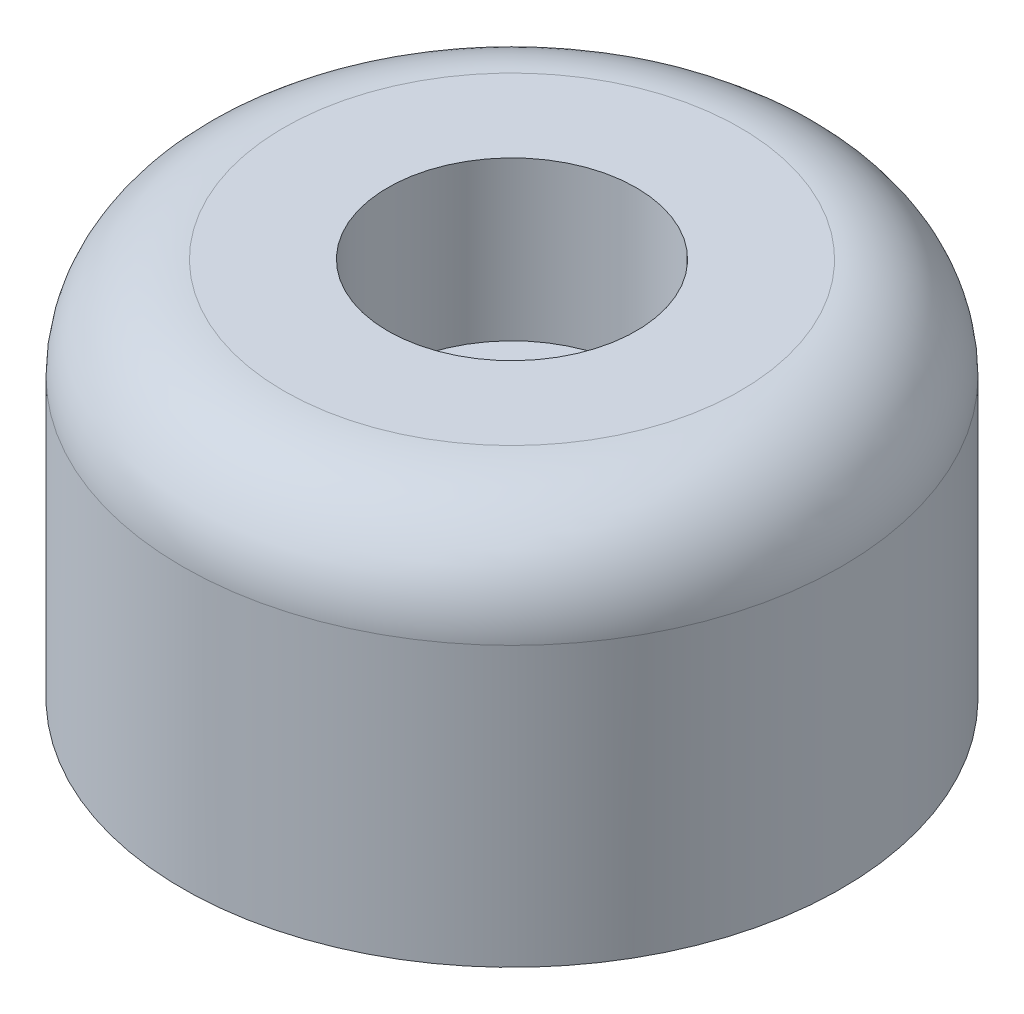
ISO-10303-21;
HEADER;
FILE_DESCRIPTION(('STEP AP214'),'2;1');
FILE_NAME('part.step','',(''),(''),'','','');
FILE_SCHEMA(('AUTOMOTIVE_DESIGN { 1 0 10303 214 1 1 1 1 }'));
ENDSEC;
DATA;
#1=APPLICATION_CONTEXT('core data for automotive mechanical design processes');
#2=APPLICATION_PROTOCOL_DEFINITION('international standard','automotive_design',2000,#1);
#3=PRODUCT_CONTEXT('',#1,'mechanical');
#4=PRODUCT('Part','Part','',(#3));
#5=PRODUCT_RELATED_PRODUCT_CATEGORY('part','',(#4));
#6=PRODUCT_DEFINITION_FORMATION('','',#4);
#7=PRODUCT_DEFINITION_CONTEXT('part definition',#1,'design');
#8=PRODUCT_DEFINITION('design','',#6,#7);
#9=PRODUCT_DEFINITION_SHAPE('','',#8);
#10=(LENGTH_UNIT() NAMED_UNIT(*) SI_UNIT(.MILLI.,.METRE.));
#11=(NAMED_UNIT(*) PLANE_ANGLE_UNIT() SI_UNIT($,.RADIAN.));
#12=(NAMED_UNIT(*) SI_UNIT($,.STERADIAN.) SOLID_ANGLE_UNIT());
#13=UNCERTAINTY_MEASURE_WITH_UNIT(LENGTH_MEASURE(1.E-05),#10,'distance_accuracy_value','');
#14=(GEOMETRIC_REPRESENTATION_CONTEXT(3) GLOBAL_UNCERTAINTY_ASSIGNED_CONTEXT((#13)) GLOBAL_UNIT_ASSIGNED_CONTEXT((#10,
#11,#12)) REPRESENTATION_CONTEXT('',''));
#15=CARTESIAN_POINT('',(0.,0.,0.));
#16=DIRECTION('',(0.,0.,1.));
#17=DIRECTION('',(1.,0.,0.));
#18=AXIS2_PLACEMENT_3D('',#15,#16,#17);
#19=CARTESIAN_POINT('',(0.,19.05,0.));
#20=DIRECTION('',(0.,-1.,0.));
#21=DIRECTION('',(0.,0.,-1.));
#22=AXIS2_PLACEMENT_3D('',#19,#20,#21);
#23=CYLINDRICAL_SURFACE('',#22,16.51);
#24=CARTESIAN_POINT('',(0.,13.97,0.));
#25=DIRECTION('',(0.,1.,0.));
#26=DIRECTION('',(0.,0.,1.));
#27=AXIS2_PLACEMENT_3D('',#24,#25,#26);
#28=CIRCLE('',#27,16.51);
#29=CARTESIAN_POINT('',(0.,13.97,-16.51));
#30=VERTEX_POINT('',#29);
#31=EDGE_CURVE('E10',#30,#30,#28,.F.);
#32=CARTESIAN_POINT('',(0.,0.,0.));
#33=DIRECTION('',(0.,1.,0.));
#34=DIRECTION('',(0.,0.,1.));
#35=AXIS2_PLACEMENT_3D('',#32,#33,#34);
#36=CIRCLE('',#35,16.51);
#37=CARTESIAN_POINT('',(0.,0.,-16.51));
#38=VERTEX_POINT('',#37);
#39=EDGE_CURVE('E41',#38,#38,#36,.T.);
#40=CARTESIAN_POINT('',(0.,13.97,-16.51));
#41=CARTESIAN_POINT('',(0.,13.8244791666667,-16.51));
#42=CARTESIAN_POINT('',(0.,13.6789583333333,-16.51));
#43=CARTESIAN_POINT('',(0.,13.3879166666667,-16.51));
#44=CARTESIAN_POINT('',(0.,13.2423958333333,-16.51));
#45=CARTESIAN_POINT('',(0.,12.9513541666667,-16.51));
#46=CARTESIAN_POINT('',(0.,12.8058333333333,-16.51));
#47=CARTESIAN_POINT('',(0.,12.5147916666667,-16.51));
#48=CARTESIAN_POINT('',(0.,12.3692708333333,-16.51));
#49=CARTESIAN_POINT('',(0.,12.0782291666667,-16.51));
#50=CARTESIAN_POINT('',(0.,11.9327083333333,-16.51));
#51=CARTESIAN_POINT('',(0.,11.6416666666667,-16.51));
#52=CARTESIAN_POINT('',(0.,11.4961458333333,-16.51));
#53=CARTESIAN_POINT('',(0.,11.2051041666667,-16.51));
#54=CARTESIAN_POINT('',(0.,11.0595833333333,-16.51));
#55=CARTESIAN_POINT('',(0.,10.7685416666667,-16.51));
#56=CARTESIAN_POINT('',(0.,10.6230208333333,-16.51));
#57=CARTESIAN_POINT('',(0.,10.3319791666667,-16.51));
#58=CARTESIAN_POINT('',(0.,10.1864583333333,-16.51));
#59=CARTESIAN_POINT('',(0.,9.89541666666667,-16.51));
#60=CARTESIAN_POINT('',(0.,9.74989583333333,-16.51));
#61=CARTESIAN_POINT('',(0.,9.45885416666667,-16.51));
#62=CARTESIAN_POINT('',(0.,9.31333333333333,-16.51));
#63=CARTESIAN_POINT('',(0.,9.02229166666667,-16.51));
#64=CARTESIAN_POINT('',(0.,8.87677083333333,-16.51));
#65=CARTESIAN_POINT('',(0.,8.58572916666667,-16.51));
#66=CARTESIAN_POINT('',(0.,8.44020833333333,-16.51));
#67=CARTESIAN_POINT('',(0.,8.14916666666667,-16.51));
#68=CARTESIAN_POINT('',(0.,8.00364583333333,-16.51));
#69=CARTESIAN_POINT('',(0.,7.71260416666667,-16.51));
#70=CARTESIAN_POINT('',(0.,7.56708333333333,-16.51));
#71=CARTESIAN_POINT('',(0.,7.27604166666667,-16.51));
#72=CARTESIAN_POINT('',(0.,7.13052083333333,-16.51));
#73=CARTESIAN_POINT('',(0.,6.83947916666667,-16.51));
#74=CARTESIAN_POINT('',(0.,6.69395833333333,-16.51));
#75=CARTESIAN_POINT('',(0.,6.40291666666667,-16.51));
#76=CARTESIAN_POINT('',(0.,6.25739583333333,-16.51));
#77=CARTESIAN_POINT('',(0.,5.96635416666667,-16.51));
#78=CARTESIAN_POINT('',(0.,5.82083333333333,-16.51));
#79=CARTESIAN_POINT('',(0.,5.52979166666666,-16.51));
#80=CARTESIAN_POINT('',(0.,5.38427083333333,-16.51));
#81=CARTESIAN_POINT('',(0.,5.09322916666667,-16.51));
#82=CARTESIAN_POINT('',(0.,4.94770833333333,-16.51));
#83=CARTESIAN_POINT('',(0.,4.65666666666667,-16.51));
#84=CARTESIAN_POINT('',(0.,4.51114583333333,-16.51));
#85=CARTESIAN_POINT('',(0.,4.22010416666666,-16.51));
#86=CARTESIAN_POINT('',(0.,4.07458333333333,-16.51));
#87=CARTESIAN_POINT('',(0.,3.78354166666667,-16.51));
#88=CARTESIAN_POINT('',(0.,3.63802083333333,-16.51));
#89=CARTESIAN_POINT('',(0.,3.34697916666667,-16.51));
#90=CARTESIAN_POINT('',(0.,3.20145833333333,-16.51));
#91=CARTESIAN_POINT('',(0.,2.91041666666667,-16.51));
#92=CARTESIAN_POINT('',(0.,2.76489583333333,-16.51));
#93=CARTESIAN_POINT('',(0.,2.47385416666667,-16.51));
#94=CARTESIAN_POINT('',(0.,2.32833333333333,-16.51));
#95=CARTESIAN_POINT('',(0.,2.03729166666667,-16.51));
#96=CARTESIAN_POINT('',(0.,1.89177083333333,-16.51));
#97=CARTESIAN_POINT('',(0.,1.60072916666667,-16.51));
#98=CARTESIAN_POINT('',(0.,1.45520833333333,-16.51));
#99=CARTESIAN_POINT('',(0.,1.16416666666667,-16.51));
#100=CARTESIAN_POINT('',(0.,1.01864583333334,-16.51));
#101=CARTESIAN_POINT('',(0.,0.727604166666669,-16.51));
#102=CARTESIAN_POINT('',(0.,0.582083333333335,-16.51));
#103=CARTESIAN_POINT('',(0.,0.291041666666667,-16.51));
#104=CARTESIAN_POINT('',(0.,0.145520833333334,-16.51));
#105=CARTESIAN_POINT('',(0.,0.,-16.51));
#106=B_SPLINE_CURVE_WITH_KNOTS('',3,(#40,#41,#42,#43,#44,#45,#46,#47,#48,#49,#50,#51,#52,#53,
#54,#55,#56,#57,#58,#59,#60,#61,#62,#63,#64,#65,#66,#67,#68,#69,#70,#71,#72,#73,#74,#75,#76,#77,
#78,#79,#80,#81,#82,#83,#84,#85,#86,#87,#88,#89,#90,#91,#92,#93,#94,#95,#96,#97,#98,#99,#100,
#101,#102,#103,#104,#105),.UNSPECIFIED.,.F.,.F.,(4,2,2,2,2,2,2,2,2,2,2,2,2,2,2,2,2,2,2,2,2,2,2,
2,2,2,2,2,2,2,2,2,4),(0.,0.436562500000001,0.873125000000001,1.3096875,1.74625,2.1828125,
2.619375,3.0559375,3.4925,3.9290625,4.365625,4.8021875,5.23875,5.6753125,6.111875,6.5484375,
6.985,7.4215625,7.858125,8.2946875,8.73125,9.1678125,9.604375,10.0409375,10.4775,10.9140625,
11.350625,11.7871875,12.22375,12.6603125,13.096875,13.5334375,13.97),.UNSPECIFIED.);
#107=EDGE_CURVE('BSEAM30',#30,#38,#106,.T.);
#108=ORIENTED_EDGE('',*,*,#31,.T.);
#109=ORIENTED_EDGE('',*,*,#39,.T.);
#110=ORIENTED_EDGE('',*,*,#107,.T.);
#111=ORIENTED_EDGE('',*,*,#107,.F.);
#112=EDGE_LOOP('',(#108,#110,#109,#111));
#113=FACE_BOUND('',#112,.T.);
#114=ADVANCED_FACE('F30',(#113),#23,.T.);
#115=CARTESIAN_POINT('',(0.,19.05,0.));
#116=DIRECTION('',(0.,1.,0.));
#117=DIRECTION('',(0.,0.,1.));
#118=AXIS2_PLACEMENT_3D('',#115,#116,#117);
#119=PLANE('',#118);
#120=CARTESIAN_POINT('',(0.,19.05,0.));
#121=DIRECTION('',(0.,1.,0.));
#122=DIRECTION('',(0.,0.,1.));
#123=AXIS2_PLACEMENT_3D('',#120,#121,#122);
#124=CIRCLE('',#123,11.43);
#125=CARTESIAN_POINT('',(0.,19.05,11.43));
#126=VERTEX_POINT('',#125);
#127=EDGE_CURVE('E37',#126,#126,#124,.T.);
#128=ORIENTED_EDGE('',*,*,#127,.T.);
#129=EDGE_LOOP('',(#128));
#130=FACE_BOUND('',#129,.T.);
#131=CARTESIAN_POINT('',(0.,19.05,0.));
#132=DIRECTION('',(0.,1.,0.));
#133=DIRECTION('',(0.,0.,1.));
#134=AXIS2_PLACEMENT_3D('',#131,#132,#133);
#135=CIRCLE('',#134,6.223);
#136=CARTESIAN_POINT('',(0.,19.05,6.223));
#137=VERTEX_POINT('',#136);
#138=EDGE_CURVE('E56',#137,#137,#135,.T.);
#139=ORIENTED_EDGE('',*,*,#138,.F.);
#140=EDGE_LOOP('',(#139));
#141=FACE_BOUND('',#140,.T.);
#142=ADVANCED_FACE('F62',(#130,#141),#119,.T.);
#143=CARTESIAN_POINT('',(0.,0.,0.));
#144=DIRECTION('',(0.,1.,0.));
#145=DIRECTION('',(0.,0.,1.));
#146=AXIS2_PLACEMENT_3D('',#143,#144,#145);
#147=PLANE('',#146);
#148=CARTESIAN_POINT('',(0.,0.,0.));
#149=DIRECTION('',(0.,1.,0.));
#150=DIRECTION('',(0.,0.,1.));
#151=AXIS2_PLACEMENT_3D('',#148,#149,#150);
#152=CIRCLE('',#151,4.10209999999999);
#153=CARTESIAN_POINT('',(0.,0.,4.10209999999999));
#154=VERTEX_POINT('',#153);
#155=EDGE_CURVE('E45',#154,#154,#152,.T.);
#156=ORIENTED_EDGE('',*,*,#155,.T.);
#157=EDGE_LOOP('',(#156));
#158=FACE_BOUND('',#157,.T.);
#159=ORIENTED_EDGE('',*,*,#39,.F.);
#160=EDGE_LOOP('',(#159));
#161=FACE_BOUND('',#160,.T.);
#162=ADVANCED_FACE('F64',(#158,#161),#147,.F.);
#163=CARTESIAN_POINT('',(0.,19.05,0.));
#164=DIRECTION('',(0.,1.,0.));
#165=DIRECTION('',(0.,0.,1.));
#166=AXIS2_PLACEMENT_3D('',#163,#164,#165);
#167=CYLINDRICAL_SURFACE('',#166,4.10209999999999);
#168=CARTESIAN_POINT('',(0.,11.1125,0.));
#169=DIRECTION('',(0.,1.,0.));
#170=DIRECTION('',(0.,0.,1.));
#171=AXIS2_PLACEMENT_3D('',#168,#169,#170);
#172=CIRCLE('',#171,4.10209999999999);
#173=CARTESIAN_POINT('',(0.,11.1125,4.10209999999999));
#174=VERTEX_POINT('',#173);
#175=EDGE_CURVE('E49',#174,#174,#172,.T.);
#176=ORIENTED_EDGE('',*,*,#175,.T.);
#177=EDGE_LOOP('',(#176));
#178=FACE_BOUND('',#177,.T.);
#179=ORIENTED_EDGE('',*,*,#155,.F.);
#180=EDGE_LOOP('',(#179));
#181=FACE_BOUND('',#180,.T.);
#182=ADVANCED_FACE('F70',(#178,#181),#167,.F.);
#183=CARTESIAN_POINT('',(4.10209999999999,11.1125,0.));
#184=DIRECTION('',(0.,-1.,0.));
#185=DIRECTION('',(0.,0.,-1.));
#186=AXIS2_PLACEMENT_3D('',#183,#184,#185);
#187=PLANE('',#186);
#188=ORIENTED_EDGE('',*,*,#175,.F.);
#189=EDGE_LOOP('',(#188));
#190=FACE_BOUND('',#189,.T.);
#191=CARTESIAN_POINT('',(0.,11.1125,0.));
#192=DIRECTION('',(0.,1.,0.));
#193=DIRECTION('',(0.,0.,1.));
#194=AXIS2_PLACEMENT_3D('',#191,#192,#193);
#195=CIRCLE('',#194,6.223);
#196=CARTESIAN_POINT('',(0.,11.1125,6.223));
#197=VERTEX_POINT('',#196);
#198=EDGE_CURVE('E53',#197,#197,#195,.T.);
#199=ORIENTED_EDGE('',*,*,#198,.T.);
#200=EDGE_LOOP('',(#199));
#201=FACE_BOUND('',#200,.T.);
#202=ADVANCED_FACE('F76',(#190,#201),#187,.F.);
#203=CARTESIAN_POINT('',(0.,19.05,0.));
#204=DIRECTION('',(0.,1.,0.));
#205=DIRECTION('',(0.,0.,1.));
#206=AXIS2_PLACEMENT_3D('',#203,#204,#205);
#207=CYLINDRICAL_SURFACE('',#206,6.223);
#208=ORIENTED_EDGE('',*,*,#198,.F.);
#209=EDGE_LOOP('',(#208));
#210=FACE_BOUND('',#209,.T.);
#211=ORIENTED_EDGE('',*,*,#138,.T.);
#212=EDGE_LOOP('',(#211));
#213=FACE_BOUND('',#212,.T.);
#214=ADVANCED_FACE('F60',(#210,#213),#207,.F.);
#215=CARTESIAN_POINT('',(0.,13.97,0.));
#216=DIRECTION('',(0.,1.,0.));
#217=DIRECTION('',(0.,0.,1.));
#218=AXIS2_PLACEMENT_3D('',#215,#216,#217);
#219=TOROIDAL_SURFACE('',#218,11.43,5.08);
#220=ORIENTED_EDGE('',*,*,#31,.F.);
#221=EDGE_LOOP('',(#220));
#222=FACE_BOUND('',#221,.T.);
#223=ORIENTED_EDGE('',*,*,#127,.F.);
#224=EDGE_LOOP('',(#223));
#225=FACE_BOUND('',#224,.T.);
#226=ADVANCED_FACE('F32',(#222,#225),#219,.T.);
#227=CLOSED_SHELL('',(#114,#142,#162,#182,#202,#214,#226));
#228=MANIFOLD_SOLID_BREP('B2',#227);
#229=ADVANCED_BREP_SHAPE_REPRESENTATION('',(#18,#228),#14);
#230=SHAPE_DEFINITION_REPRESENTATION(#9,#229);
ENDSEC;
END-ISO-10303-21;
